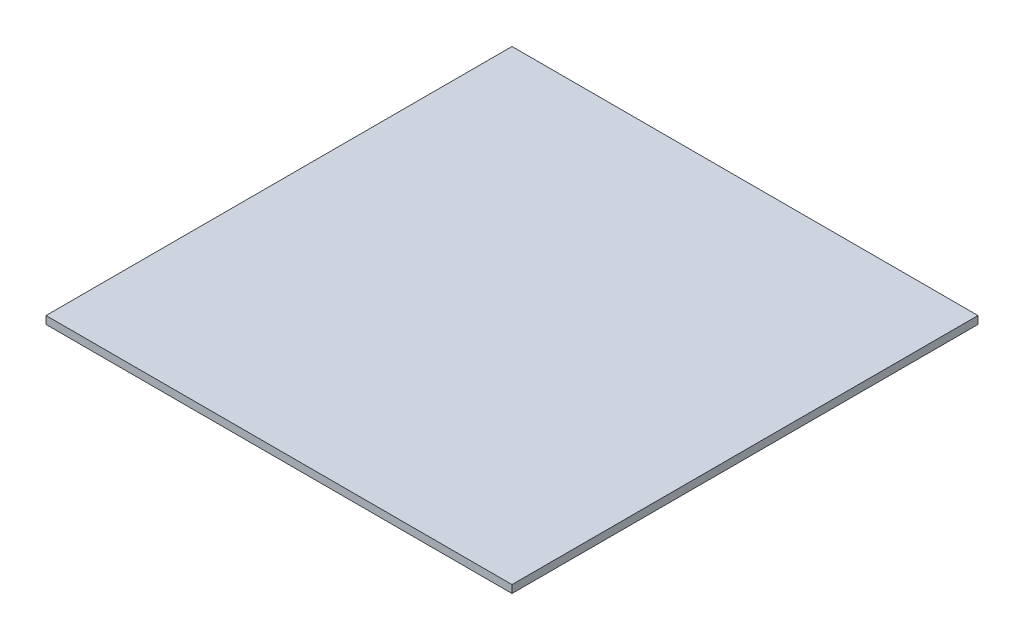
ISO-10303-21;
HEADER;
FILE_DESCRIPTION(('STEP AP214'),'2;1');
FILE_NAME('part.step','',(''),(''),'','','');
FILE_SCHEMA(('AUTOMOTIVE_DESIGN { 1 0 10303 214 1 1 1 1 }'));
ENDSEC;
DATA;
#1=APPLICATION_CONTEXT('core data for automotive mechanical design processes');
#2=APPLICATION_PROTOCOL_DEFINITION('international standard','automotive_design',2000,#1);
#3=PRODUCT_CONTEXT('',#1,'mechanical');
#4=PRODUCT('Part','Part','',(#3));
#5=PRODUCT_RELATED_PRODUCT_CATEGORY('part','',(#4));
#6=PRODUCT_DEFINITION_FORMATION('','',#4);
#7=PRODUCT_DEFINITION_CONTEXT('part definition',#1,'design');
#8=PRODUCT_DEFINITION('design','',#6,#7);
#9=PRODUCT_DEFINITION_SHAPE('','',#8);
#10=(LENGTH_UNIT() NAMED_UNIT(*) SI_UNIT(.MILLI.,.METRE.));
#11=(NAMED_UNIT(*) PLANE_ANGLE_UNIT() SI_UNIT($,.RADIAN.));
#12=(NAMED_UNIT(*) SI_UNIT($,.STERADIAN.) SOLID_ANGLE_UNIT());
#13=UNCERTAINTY_MEASURE_WITH_UNIT(LENGTH_MEASURE(1.E-05),#10,'distance_accuracy_value','');
#14=(GEOMETRIC_REPRESENTATION_CONTEXT(3) GLOBAL_UNCERTAINTY_ASSIGNED_CONTEXT((#13)) GLOBAL_UNIT_ASSIGNED_CONTEXT((#10,
#11,#12)) REPRESENTATION_CONTEXT('',''));
#15=CARTESIAN_POINT('',(0.,0.,0.));
#16=DIRECTION('',(0.,0.,1.));
#17=DIRECTION('',(1.,0.,0.));
#18=AXIS2_PLACEMENT_3D('',#15,#16,#17);
#19=CARTESIAN_POINT('',(300.,10.,-300.));
#20=DIRECTION('',(-1.,0.,0.));
#21=DIRECTION('',(0.,0.,1.));
#22=AXIS2_PLACEMENT_3D('',#19,#20,#21);
#23=PLANE('',#22);
#24=DIRECTION('',(0.,0.,-1.));
#25=VECTOR('',#24,1.);
#26=CARTESIAN_POINT('',(300.,0.,-300.));
#27=LINE('',#26,#25);
#28=CARTESIAN_POINT('',(300.,0.,300.));
#29=VERTEX_POINT('',#28);
#30=CARTESIAN_POINT('',(300.,0.,-300.));
#31=VERTEX_POINT('',#30);
#32=EDGE_CURVE('E98',#29,#31,#27,.T.);
#33=ORIENTED_EDGE('',*,*,#32,.T.);
#34=DIRECTION('',(0.,-1.,0.));
#35=VECTOR('',#34,1.);
#36=CARTESIAN_POINT('',(300.,10.,-300.));
#37=LINE('',#36,#35);
#38=CARTESIAN_POINT('',(300.,10.,-300.));
#39=VERTEX_POINT('',#38);
#40=EDGE_CURVE('E11',#39,#31,#37,.T.);
#41=ORIENTED_EDGE('',*,*,#40,.F.);
#42=DIRECTION('',(0.,0.,-1.));
#43=VECTOR('',#42,1.);
#44=CARTESIAN_POINT('',(300.,10.,-300.));
#45=LINE('',#44,#43);
#46=CARTESIAN_POINT('',(300.,10.,300.));
#47=VERTEX_POINT('',#46);
#48=EDGE_CURVE('E86',#47,#39,#45,.T.);
#49=ORIENTED_EDGE('',*,*,#48,.F.);
#50=DIRECTION('',(0.,-1.,0.));
#51=VECTOR('',#50,1.);
#52=CARTESIAN_POINT('',(300.,10.,300.));
#53=LINE('',#52,#51);
#54=EDGE_CURVE('E94',#47,#29,#53,.T.);
#55=ORIENTED_EDGE('',*,*,#54,.T.);
#56=EDGE_LOOP('',(#33,#41,#49,#55));
#57=FACE_BOUND('',#56,.T.);
#58=ADVANCED_FACE('F35',(#57),#23,.F.);
#59=CARTESIAN_POINT('',(-300.,10.,-300.));
#60=DIRECTION('',(0.,0.,1.));
#61=DIRECTION('',(1.,0.,0.));
#62=AXIS2_PLACEMENT_3D('',#59,#60,#61);
#63=PLANE('',#62);
#64=DIRECTION('',(-1.,0.,0.));
#65=VECTOR('',#64,1.);
#66=CARTESIAN_POINT('',(-300.,0.,-300.));
#67=LINE('',#66,#65);
#68=CARTESIAN_POINT('',(-300.,0.,-300.));
#69=VERTEX_POINT('',#68);
#70=EDGE_CURVE('E90',#31,#69,#67,.T.);
#71=ORIENTED_EDGE('',*,*,#70,.T.);
#72=DIRECTION('',(0.,-1.,0.));
#73=VECTOR('',#72,1.);
#74=CARTESIAN_POINT('',(-300.,10.,-300.));
#75=LINE('',#74,#73);
#76=CARTESIAN_POINT('',(-300.,10.,-300.));
#77=VERTEX_POINT('',#76);
#78=EDGE_CURVE('E43',#77,#69,#75,.T.);
#79=ORIENTED_EDGE('',*,*,#78,.F.);
#80=DIRECTION('',(-1.,0.,0.));
#81=VECTOR('',#80,1.);
#82=CARTESIAN_POINT('',(-300.,10.,-300.));
#83=LINE('',#82,#81);
#84=EDGE_CURVE('E81',#39,#77,#83,.T.);
#85=ORIENTED_EDGE('',*,*,#84,.F.);
#86=ORIENTED_EDGE('',*,*,#40,.T.);
#87=EDGE_LOOP('',(#71,#79,#85,#86));
#88=FACE_BOUND('',#87,.T.);
#89=ADVANCED_FACE('F89',(#88),#63,.F.);
#90=CARTESIAN_POINT('',(-300.,10.,-300.));
#91=DIRECTION('',(1.,0.,0.));
#92=DIRECTION('',(0.,0.,-1.));
#93=AXIS2_PLACEMENT_3D('',#90,#91,#92);
#94=PLANE('',#93);
#95=DIRECTION('',(0.,0.,1.));
#96=VECTOR('',#95,1.);
#97=CARTESIAN_POINT('',(-300.,0.,-300.));
#98=LINE('',#97,#96);
#99=CARTESIAN_POINT('',(-300.,0.,300.));
#100=VERTEX_POINT('',#99);
#101=EDGE_CURVE('E68',#69,#100,#98,.T.);
#102=ORIENTED_EDGE('',*,*,#101,.T.);
#103=DIRECTION('',(0.,-1.,0.));
#104=VECTOR('',#103,1.);
#105=CARTESIAN_POINT('',(-300.,10.,300.));
#106=LINE('',#105,#104);
#107=CARTESIAN_POINT('',(-300.,10.,300.));
#108=VERTEX_POINT('',#107);
#109=EDGE_CURVE('E91',#108,#100,#106,.T.);
#110=ORIENTED_EDGE('',*,*,#109,.F.);
#111=DIRECTION('',(0.,0.,1.));
#112=VECTOR('',#111,1.);
#113=CARTESIAN_POINT('',(-300.,10.,-300.));
#114=LINE('',#113,#112);
#115=EDGE_CURVE('E84',#77,#108,#114,.T.);
#116=ORIENTED_EDGE('',*,*,#115,.F.);
#117=ORIENTED_EDGE('',*,*,#78,.T.);
#118=EDGE_LOOP('',(#102,#110,#116,#117));
#119=FACE_BOUND('',#118,.T.);
#120=ADVANCED_FACE('F92',(#119),#94,.F.);
#121=CARTESIAN_POINT('',(-300.,10.,300.));
#122=DIRECTION('',(0.,0.,-1.));
#123=DIRECTION('',(-1.,0.,0.));
#124=AXIS2_PLACEMENT_3D('',#121,#122,#123);
#125=PLANE('',#124);
#126=DIRECTION('',(1.,0.,0.));
#127=VECTOR('',#126,1.);
#128=CARTESIAN_POINT('',(-300.,0.,300.));
#129=LINE('',#128,#127);
#130=EDGE_CURVE('E74',#100,#29,#129,.T.);
#131=ORIENTED_EDGE('',*,*,#130,.T.);
#132=ORIENTED_EDGE('',*,*,#54,.F.);
#133=DIRECTION('',(1.,0.,0.));
#134=VECTOR('',#133,1.);
#135=CARTESIAN_POINT('',(-300.,10.,300.));
#136=LINE('',#135,#134);
#137=EDGE_CURVE('E51',#108,#47,#136,.T.);
#138=ORIENTED_EDGE('',*,*,#137,.F.);
#139=ORIENTED_EDGE('',*,*,#109,.T.);
#140=EDGE_LOOP('',(#131,#132,#138,#139));
#141=FACE_BOUND('',#140,.T.);
#142=ADVANCED_FACE('F105',(#141),#125,.F.);
#143=CARTESIAN_POINT('',(0.,10.,0.));
#144=DIRECTION('',(0.,1.,0.));
#145=DIRECTION('',(0.,0.,1.));
#146=AXIS2_PLACEMENT_3D('',#143,#144,#145);
#147=PLANE('',#146);
#148=ORIENTED_EDGE('',*,*,#48,.T.);
#149=ORIENTED_EDGE('',*,*,#84,.T.);
#150=ORIENTED_EDGE('',*,*,#115,.T.);
#151=ORIENTED_EDGE('',*,*,#137,.T.);
#152=EDGE_LOOP('',(#148,#149,#150,#151));
#153=FACE_BOUND('',#152,.T.);
#154=ADVANCED_FACE('F82',(#153),#147,.T.);
#155=CARTESIAN_POINT('',(0.,0.,0.));
#156=DIRECTION('',(0.,1.,0.));
#157=DIRECTION('',(0.,0.,1.));
#158=AXIS2_PLACEMENT_3D('',#155,#156,#157);
#159=PLANE('',#158);
#160=ORIENTED_EDGE('',*,*,#32,.F.);
#161=ORIENTED_EDGE('',*,*,#130,.F.);
#162=ORIENTED_EDGE('',*,*,#101,.F.);
#163=ORIENTED_EDGE('',*,*,#70,.F.);
#164=EDGE_LOOP('',(#160,#161,#162,#163));
#165=FACE_BOUND('',#164,.T.);
#166=ADVANCED_FACE('F108',(#165),#159,.F.);
#167=CLOSED_SHELL('',(#58,#89,#120,#142,#154,#166));
#168=MANIFOLD_SOLID_BREP('B2',#167);
#169=ADVANCED_BREP_SHAPE_REPRESENTATION('',(#18,#168),#14);
#170=SHAPE_DEFINITION_REPRESENTATION(#9,#169);
ENDSEC;
END-ISO-10303-21;
